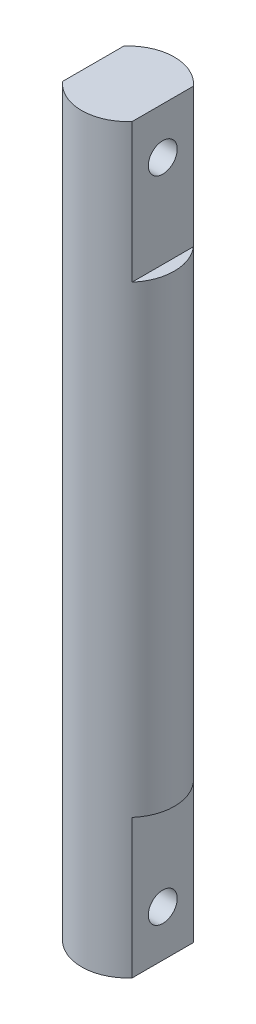
ISO-10303-21;
HEADER;
FILE_DESCRIPTION(('STEP AP214'),'2;1');
FILE_NAME('part.step','',(''),(''),'','','');
FILE_SCHEMA(('AUTOMOTIVE_DESIGN { 1 0 10303 214 1 1 1 1 }'));
ENDSEC;
DATA;
#1=APPLICATION_CONTEXT('core data for automotive mechanical design processes');
#2=APPLICATION_PROTOCOL_DEFINITION('international standard','automotive_design',2000,#1);
#3=PRODUCT_CONTEXT('',#1,'mechanical');
#4=PRODUCT('Part','Part','',(#3));
#5=PRODUCT_RELATED_PRODUCT_CATEGORY('part','',(#4));
#6=PRODUCT_DEFINITION_FORMATION('','',#4);
#7=PRODUCT_DEFINITION_CONTEXT('part definition',#1,'design');
#8=PRODUCT_DEFINITION('design','',#6,#7);
#9=PRODUCT_DEFINITION_SHAPE('','',#8);
#10=(LENGTH_UNIT() NAMED_UNIT(*) SI_UNIT(.MILLI.,.METRE.));
#11=(NAMED_UNIT(*) PLANE_ANGLE_UNIT() SI_UNIT($,.RADIAN.));
#12=(NAMED_UNIT(*) SI_UNIT($,.STERADIAN.) SOLID_ANGLE_UNIT());
#13=UNCERTAINTY_MEASURE_WITH_UNIT(LENGTH_MEASURE(1.E-05),#10,'distance_accuracy_value','');
#14=(GEOMETRIC_REPRESENTATION_CONTEXT(3) GLOBAL_UNCERTAINTY_ASSIGNED_CONTEXT((#13)) GLOBAL_UNIT_ASSIGNED_CONTEXT((#10,
#11,#12)) REPRESENTATION_CONTEXT('',''));
#15=CARTESIAN_POINT('',(0.,0.,0.));
#16=DIRECTION('',(0.,0.,1.));
#17=DIRECTION('',(1.,0.,0.));
#18=AXIS2_PLACEMENT_3D('',#15,#16,#17);
#19=CARTESIAN_POINT('',(0.,-32.,0.));
#20=DIRECTION('',(0.,1.,0.));
#21=DIRECTION('',(0.,0.,1.));
#22=AXIS2_PLACEMENT_3D('',#19,#20,#21);
#23=CYLINDRICAL_SURFACE('',#22,4.);
#24=DIRECTION('',(0.,1.,0.));
#25=VECTOR('',#24,1.);
#26=CARTESIAN_POINT('',(-3.,20.,-2.64575131106459));
#27=LINE('',#26,#25);
#28=CARTESIAN_POINT('',(-3.,20.,-2.64575131106459));
#29=VERTEX_POINT('',#28);
#30=CARTESIAN_POINT('',(-3.,32.,-2.64575131106459));
#31=VERTEX_POINT('',#30);
#32=EDGE_CURVE('E119',#29,#31,#27,.T.);
#33=ORIENTED_EDGE('',*,*,#32,.T.);
#34=CARTESIAN_POINT('',(0.,32.,0.));
#35=DIRECTION('',(0.,1.,0.));
#36=DIRECTION('',(0.,0.,1.));
#37=AXIS2_PLACEMENT_3D('',#34,#35,#36);
#38=CIRCLE('',#37,4.);
#39=CARTESIAN_POINT('',(3.,32.,-2.64575131106459));
#40=VERTEX_POINT('',#39);
#41=EDGE_CURVE('E132',#40,#31,#38,.T.);
#42=ORIENTED_EDGE('',*,*,#41,.F.);
#43=DIRECTION('',(0.,1.,0.));
#44=VECTOR('',#43,1.);
#45=CARTESIAN_POINT('',(3.,-32.,-2.64575131106459));
#46=LINE('',#45,#44);
#47=CARTESIAN_POINT('',(3.,20.,-2.64575131106459));
#48=VERTEX_POINT('',#47);
#49=EDGE_CURVE('E163',#40,#48,#46,.F.);
#50=ORIENTED_EDGE('',*,*,#49,.T.);
#51=CARTESIAN_POINT('',(0.,20.,0.));
#52=DIRECTION('',(0.,-1.,0.));
#53=DIRECTION('',(0.,0.,-1.));
#54=AXIS2_PLACEMENT_3D('',#51,#52,#53);
#55=CIRCLE('',#54,4.);
#56=CARTESIAN_POINT('',(3.,20.,2.64575131106459));
#57=VERTEX_POINT('',#56);
#58=EDGE_CURVE('E11',#57,#48,#55,.F.);
#59=ORIENTED_EDGE('',*,*,#58,.F.);
#60=DIRECTION('',(0.,1.,0.));
#61=VECTOR('',#60,1.);
#62=CARTESIAN_POINT('',(3.,-32.,2.64575131106459));
#63=LINE('',#62,#61);
#64=CARTESIAN_POINT('',(3.,32.,2.64575131106459));
#65=VERTEX_POINT('',#64);
#66=EDGE_CURVE('E194',#57,#65,#63,.T.);
#67=ORIENTED_EDGE('',*,*,#66,.T.);
#68=CARTESIAN_POINT('',(-3.,32.,2.64575131106459));
#69=VERTEX_POINT('',#68);
#70=EDGE_CURVE('E141',#69,#65,#38,.T.);
#71=ORIENTED_EDGE('',*,*,#70,.F.);
#72=DIRECTION('',(0.,1.,0.));
#73=VECTOR('',#72,1.);
#74=CARTESIAN_POINT('',(-3.,20.,2.64575131106459));
#75=LINE('',#74,#73);
#76=CARTESIAN_POINT('',(-3.,20.,2.64575131106459));
#77=VERTEX_POINT('',#76);
#78=EDGE_CURVE('E67',#77,#69,#75,.T.);
#79=ORIENTED_EDGE('',*,*,#78,.F.);
#80=CARTESIAN_POINT('',(0.,20.,0.));
#81=DIRECTION('',(0.,1.,0.));
#82=DIRECTION('',(0.,0.,-1.));
#83=AXIS2_PLACEMENT_3D('',#80,#81,#82);
#84=CIRCLE('',#83,4.);
#85=EDGE_CURVE('E125',#29,#77,#84,.T.);
#86=ORIENTED_EDGE('',*,*,#85,.F.);
#87=EDGE_LOOP('',(#33,#42,#50,#59,#67,#71,#79,#86));
#88=FACE_BOUND('',#87,.T.);
#89=DIRECTION('',(0.,-1.,0.));
#90=VECTOR('',#89,1.);
#91=CARTESIAN_POINT('',(-3.,-20.,-2.64575131106458));
#92=LINE('',#91,#90);
#93=CARTESIAN_POINT('',(-3.,-20.,-2.64575131106458));
#94=VERTEX_POINT('',#93);
#95=CARTESIAN_POINT('',(-3.,-32.,-2.64575131106459));
#96=VERTEX_POINT('',#95);
#97=EDGE_CURVE('E75',#94,#96,#92,.T.);
#98=ORIENTED_EDGE('',*,*,#97,.F.);
#99=CARTESIAN_POINT('',(0.,-20.,0.));
#100=DIRECTION('',(0.,-1.,0.));
#101=DIRECTION('',(0.,0.,1.));
#102=AXIS2_PLACEMENT_3D('',#99,#100,#101);
#103=CIRCLE('',#102,4.);
#104=CARTESIAN_POINT('',(-3.,-20.,2.6457513110646));
#105=VERTEX_POINT('',#104);
#106=EDGE_CURVE('E176',#105,#94,#103,.T.);
#107=ORIENTED_EDGE('',*,*,#106,.F.);
#108=DIRECTION('',(0.,-1.,0.));
#109=VECTOR('',#108,1.);
#110=CARTESIAN_POINT('',(-3.,-20.,2.6457513110646));
#111=LINE('',#110,#109);
#112=CARTESIAN_POINT('',(-3.,-32.,2.6457513110646));
#113=VERTEX_POINT('',#112);
#114=EDGE_CURVE('E184',#105,#113,#111,.T.);
#115=ORIENTED_EDGE('',*,*,#114,.T.);
#116=CARTESIAN_POINT('',(0.,-32.,0.));
#117=DIRECTION('',(0.,1.,0.));
#118=DIRECTION('',(0.,0.,1.));
#119=AXIS2_PLACEMENT_3D('',#116,#117,#118);
#120=CIRCLE('',#119,4.);
#121=CARTESIAN_POINT('',(3.,-32.,2.64575131106459));
#122=VERTEX_POINT('',#121);
#123=EDGE_CURVE('E140',#113,#122,#120,.T.);
#124=ORIENTED_EDGE('',*,*,#123,.T.);
#125=DIRECTION('',(0.,1.,0.));
#126=VECTOR('',#125,1.);
#127=CARTESIAN_POINT('',(3.,-32.,2.64575131106459));
#128=LINE('',#127,#126);
#129=CARTESIAN_POINT('',(3.,-20.,2.6457513110646));
#130=VERTEX_POINT('',#129);
#131=EDGE_CURVE('E201',#122,#130,#128,.T.);
#132=ORIENTED_EDGE('',*,*,#131,.T.);
#133=CARTESIAN_POINT('',(0.,-20.,0.));
#134=DIRECTION('',(0.,1.,0.));
#135=DIRECTION('',(0.,0.,1.));
#136=AXIS2_PLACEMENT_3D('',#133,#134,#135);
#137=CIRCLE('',#136,4.);
#138=CARTESIAN_POINT('',(3.,-20.,-2.64575131106458));
#139=VERTEX_POINT('',#138);
#140=EDGE_CURVE('E59',#139,#130,#137,.F.);
#141=ORIENTED_EDGE('',*,*,#140,.F.);
#142=DIRECTION('',(0.,1.,0.));
#143=VECTOR('',#142,1.);
#144=CARTESIAN_POINT('',(3.,-32.,-2.64575131106459));
#145=LINE('',#144,#143);
#146=CARTESIAN_POINT('',(3.,-32.,-2.64575131106459));
#147=VERTEX_POINT('',#146);
#148=EDGE_CURVE('E147',#139,#147,#145,.F.);
#149=ORIENTED_EDGE('',*,*,#148,.T.);
#150=EDGE_CURVE('E145',#147,#96,#120,.T.);
#151=ORIENTED_EDGE('',*,*,#150,.T.);
#152=EDGE_LOOP('',(#98,#107,#115,#124,#132,#141,#149,#151));
#153=FACE_BOUND('',#152,.T.);
#154=ADVANCED_FACE('F50',(#88,#153),#23,.T.);
#155=CARTESIAN_POINT('',(0.,-32.,0.));
#156=DIRECTION('',(0.,1.,0.));
#157=DIRECTION('',(0.,0.,1.));
#158=AXIS2_PLACEMENT_3D('',#155,#156,#157);
#159=PLANE('',#158);
#160=ORIENTED_EDGE('',*,*,#123,.F.);
#161=DIRECTION('',(0.,0.,1.));
#162=VECTOR('',#161,1.);
#163=CARTESIAN_POINT('',(-3.,-32.,-2.64575131106458));
#164=LINE('',#163,#162);
#165=EDGE_CURVE('E169',#96,#113,#164,.T.);
#166=ORIENTED_EDGE('',*,*,#165,.F.);
#167=ORIENTED_EDGE('',*,*,#150,.F.);
#168=DIRECTION('',(0.,0.,-1.));
#169=VECTOR('',#168,1.);
#170=CARTESIAN_POINT('',(3.,-32.,0.));
#171=LINE('',#170,#169);
#172=EDGE_CURVE('E162',#122,#147,#171,.T.);
#173=ORIENTED_EDGE('',*,*,#172,.F.);
#174=EDGE_LOOP('',(#160,#166,#167,#173));
#175=FACE_BOUND('',#174,.T.);
#176=ADVANCED_FACE('F214',(#175),#159,.F.);
#177=CARTESIAN_POINT('',(0.,32.,0.));
#178=DIRECTION('',(0.,1.,0.));
#179=DIRECTION('',(0.,0.,1.));
#180=AXIS2_PLACEMENT_3D('',#177,#178,#179);
#181=PLANE('',#180);
#182=DIRECTION('',(0.,0.,-1.));
#183=VECTOR('',#182,1.);
#184=CARTESIAN_POINT('',(-3.,32.,2.64575131106459));
#185=LINE('',#184,#183);
#186=EDGE_CURVE('E115',#69,#31,#185,.T.);
#187=ORIENTED_EDGE('',*,*,#186,.F.);
#188=ORIENTED_EDGE('',*,*,#70,.T.);
#189=DIRECTION('',(0.,0.,-1.));
#190=VECTOR('',#189,1.);
#191=CARTESIAN_POINT('',(3.,32.,0.));
#192=LINE('',#191,#190);
#193=EDGE_CURVE('E138',#65,#40,#192,.T.);
#194=ORIENTED_EDGE('',*,*,#193,.T.);
#195=ORIENTED_EDGE('',*,*,#41,.T.);
#196=EDGE_LOOP('',(#187,#188,#194,#195));
#197=FACE_BOUND('',#196,.T.);
#198=ADVANCED_FACE('F136',(#197),#181,.T.);
#199=CARTESIAN_POINT('',(10.,-28.,0.));
#200=DIRECTION('',(1.,0.,0.));
#201=DIRECTION('',(0.,0.,-1.));
#202=AXIS2_PLACEMENT_3D('',#199,#200,#201);
#203=CYLINDRICAL_SURFACE('',#202,1.24999999999999);
#204=CARTESIAN_POINT('',(-3.,-28.,0.));
#205=DIRECTION('',(1.,0.,0.));
#206=DIRECTION('',(0.,0.,-1.));
#207=AXIS2_PLACEMENT_3D('',#204,#205,#206);
#208=CIRCLE('',#207,1.24999999999999);
#209=CARTESIAN_POINT('',(-3.,-28.,-1.24999999999999));
#210=VERTEX_POINT('',#209);
#211=EDGE_CURVE('E165',#210,#210,#208,.F.);
#212=ORIENTED_EDGE('',*,*,#211,.T.);
#213=EDGE_LOOP('',(#212));
#214=FACE_BOUND('',#213,.T.);
#215=CARTESIAN_POINT('',(3.,-28.,0.));
#216=DIRECTION('',(1.,0.,0.));
#217=DIRECTION('',(0.,0.,-1.));
#218=AXIS2_PLACEMENT_3D('',#215,#216,#217);
#219=CIRCLE('',#218,1.24999999999999);
#220=CARTESIAN_POINT('',(3.,-28.,-1.24999999999999));
#221=VERTEX_POINT('',#220);
#222=EDGE_CURVE('E158',#221,#221,#219,.F.);
#223=ORIENTED_EDGE('',*,*,#222,.F.);
#224=EDGE_LOOP('',(#223));
#225=FACE_BOUND('',#224,.T.);
#226=ADVANCED_FACE('F239',(#214,#225),#203,.F.);
#227=CARTESIAN_POINT('',(10.,28.,0.));
#228=DIRECTION('',(1.,0.,0.));
#229=DIRECTION('',(0.,0.,-1.));
#230=AXIS2_PLACEMENT_3D('',#227,#228,#229);
#231=CYLINDRICAL_SURFACE('',#230,1.24999999999999);
#232=CARTESIAN_POINT('',(-3.,28.,0.));
#233=DIRECTION('',(1.,0.,0.));
#234=DIRECTION('',(0.,0.,-1.));
#235=AXIS2_PLACEMENT_3D('',#232,#233,#234);
#236=CIRCLE('',#235,1.24999999999999);
#237=CARTESIAN_POINT('',(-3.,28.,-1.24999999999999));
#238=VERTEX_POINT('',#237);
#239=EDGE_CURVE('E53',#238,#238,#236,.F.);
#240=ORIENTED_EDGE('',*,*,#239,.T.);
#241=EDGE_LOOP('',(#240));
#242=FACE_BOUND('',#241,.T.);
#243=CARTESIAN_POINT('',(3.,28.,0.));
#244=DIRECTION('',(1.,0.,0.));
#245=DIRECTION('',(0.,0.,-1.));
#246=AXIS2_PLACEMENT_3D('',#243,#244,#245);
#247=CIRCLE('',#246,1.24999999999999);
#248=CARTESIAN_POINT('',(3.,28.,-1.24999999999999));
#249=VERTEX_POINT('',#248);
#250=EDGE_CURVE('E153',#249,#249,#247,.F.);
#251=ORIENTED_EDGE('',*,*,#250,.F.);
#252=EDGE_LOOP('',(#251));
#253=FACE_BOUND('',#252,.T.);
#254=ADVANCED_FACE('F244',(#242,#253),#231,.F.);
#255=CARTESIAN_POINT('',(3.,0.,0.));
#256=DIRECTION('',(1.,0.,0.));
#257=DIRECTION('',(0.,0.,-1.));
#258=AXIS2_PLACEMENT_3D('',#255,#256,#257);
#259=PLANE('',#258);
#260=ORIENTED_EDGE('',*,*,#193,.F.);
#261=ORIENTED_EDGE('',*,*,#66,.F.);
#262=DIRECTION('',(0.,0.,-1.));
#263=VECTOR('',#262,1.);
#264=CARTESIAN_POINT('',(3.,20.,17.2448279082892));
#265=LINE('',#264,#263);
#266=EDGE_CURVE('E157',#57,#48,#265,.T.);
#267=ORIENTED_EDGE('',*,*,#266,.T.);
#268=ORIENTED_EDGE('',*,*,#49,.F.);
#269=EDGE_LOOP('',(#260,#261,#267,#268));
#270=FACE_BOUND('',#269,.T.);
#271=ORIENTED_EDGE('',*,*,#250,.T.);
#272=EDGE_LOOP('',(#271));
#273=FACE_BOUND('',#272,.T.);
#274=ADVANCED_FACE('F246',(#270,#273),#259,.T.);
#275=CARTESIAN_POINT('',(3.,20.,17.2448279082892));
#276=DIRECTION('',(0.,-1.,0.));
#277=DIRECTION('',(0.,0.,-1.));
#278=AXIS2_PLACEMENT_3D('',#275,#276,#277);
#279=PLANE('',#278);
#280=ORIENTED_EDGE('',*,*,#58,.T.);
#281=ORIENTED_EDGE('',*,*,#266,.F.);
#282=EDGE_LOOP('',(#280,#281));
#283=FACE_BOUND('',#282,.T.);
#284=ADVANCED_FACE('F229',(#283),#279,.F.);
#285=CARTESIAN_POINT('',(3.,0.,0.));
#286=DIRECTION('',(1.,0.,0.));
#287=DIRECTION('',(0.,0.,-1.));
#288=AXIS2_PLACEMENT_3D('',#285,#286,#287);
#289=PLANE('',#288);
#290=DIRECTION('',(0.,0.,1.));
#291=VECTOR('',#290,1.);
#292=CARTESIAN_POINT('',(3.,-20.,23.3194832801855));
#293=LINE('',#292,#291);
#294=EDGE_CURVE('E168',#139,#130,#293,.T.);
#295=ORIENTED_EDGE('',*,*,#294,.T.);
#296=ORIENTED_EDGE('',*,*,#131,.F.);
#297=ORIENTED_EDGE('',*,*,#172,.T.);
#298=ORIENTED_EDGE('',*,*,#148,.F.);
#299=EDGE_LOOP('',(#295,#296,#297,#298));
#300=FACE_BOUND('',#299,.T.);
#301=ORIENTED_EDGE('',*,*,#222,.T.);
#302=EDGE_LOOP('',(#301));
#303=FACE_BOUND('',#302,.T.);
#304=ADVANCED_FACE('F216',(#300,#303),#289,.T.);
#305=CARTESIAN_POINT('',(3.,-20.,23.3194832801855));
#306=DIRECTION('',(0.,1.,0.));
#307=DIRECTION('',(0.,0.,1.));
#308=AXIS2_PLACEMENT_3D('',#305,#306,#307);
#309=PLANE('',#308);
#310=ORIENTED_EDGE('',*,*,#140,.T.);
#311=ORIENTED_EDGE('',*,*,#294,.F.);
#312=EDGE_LOOP('',(#310,#311));
#313=FACE_BOUND('',#312,.T.);
#314=ADVANCED_FACE('F219',(#313),#309,.F.);
#315=CARTESIAN_POINT('',(-3.,-20.,-2.64575131106458));
#316=DIRECTION('',(1.,0.,0.));
#317=DIRECTION('',(0.,0.,-1.));
#318=AXIS2_PLACEMENT_3D('',#315,#316,#317);
#319=PLANE('',#318);
#320=ORIENTED_EDGE('',*,*,#165,.T.);
#321=ORIENTED_EDGE('',*,*,#114,.F.);
#322=DIRECTION('',(0.,0.,1.));
#323=VECTOR('',#322,1.);
#324=CARTESIAN_POINT('',(-3.,-20.,-2.64575131106458));
#325=LINE('',#324,#323);
#326=EDGE_CURVE('E180',#94,#105,#325,.T.);
#327=ORIENTED_EDGE('',*,*,#326,.F.);
#328=ORIENTED_EDGE('',*,*,#97,.T.);
#329=EDGE_LOOP('',(#320,#321,#327,#328));
#330=FACE_BOUND('',#329,.T.);
#331=ORIENTED_EDGE('',*,*,#211,.F.);
#332=EDGE_LOOP('',(#331));
#333=FACE_BOUND('',#332,.T.);
#334=ADVANCED_FACE('F221',(#330,#333),#319,.F.);
#335=CARTESIAN_POINT('',(0.,-20.,0.));
#336=DIRECTION('',(0.,1.,0.));
#337=DIRECTION('',(0.,0.,1.));
#338=AXIS2_PLACEMENT_3D('',#335,#336,#337);
#339=PLANE('',#338);
#340=ORIENTED_EDGE('',*,*,#106,.T.);
#341=ORIENTED_EDGE('',*,*,#326,.T.);
#342=EDGE_LOOP('',(#340,#341));
#343=FACE_BOUND('',#342,.T.);
#344=ADVANCED_FACE('F227',(#343),#339,.F.);
#345=CARTESIAN_POINT('',(-3.,20.,2.64575131106459));
#346=DIRECTION('',(1.,0.,0.));
#347=DIRECTION('',(0.,0.,-1.));
#348=AXIS2_PLACEMENT_3D('',#345,#346,#347);
#349=PLANE('',#348);
#350=ORIENTED_EDGE('',*,*,#186,.T.);
#351=ORIENTED_EDGE('',*,*,#32,.F.);
#352=DIRECTION('',(0.,0.,-1.));
#353=VECTOR('',#352,1.);
#354=CARTESIAN_POINT('',(-3.,20.,2.64575131106459));
#355=LINE('',#354,#353);
#356=EDGE_CURVE('E264',#77,#29,#355,.T.);
#357=ORIENTED_EDGE('',*,*,#356,.F.);
#358=ORIENTED_EDGE('',*,*,#78,.T.);
#359=EDGE_LOOP('',(#350,#351,#357,#358));
#360=FACE_BOUND('',#359,.T.);
#361=ORIENTED_EDGE('',*,*,#239,.F.);
#362=EDGE_LOOP('',(#361));
#363=FACE_BOUND('',#362,.T.);
#364=ADVANCED_FACE('F117',(#360,#363),#349,.F.);
#365=CARTESIAN_POINT('',(0.,20.,0.));
#366=DIRECTION('',(0.,-1.,0.));
#367=DIRECTION('',(0.,0.,-1.));
#368=AXIS2_PLACEMENT_3D('',#365,#366,#367);
#369=PLANE('',#368);
#370=ORIENTED_EDGE('',*,*,#85,.T.);
#371=ORIENTED_EDGE('',*,*,#356,.T.);
#372=EDGE_LOOP('',(#370,#371));
#373=FACE_BOUND('',#372,.T.);
#374=ADVANCED_FACE('F269',(#373),#369,.F.);
#375=CLOSED_SHELL('',(#154,#176,#198,#226,#254,#274,#284,#304,#314,#334,#344,#364,#374));
#376=MANIFOLD_SOLID_BREP('B2',#375);
#377=ADVANCED_BREP_SHAPE_REPRESENTATION('',(#18,#376),#14);
#378=SHAPE_DEFINITION_REPRESENTATION(#9,#377);
ENDSEC;
END-ISO-10303-21;
